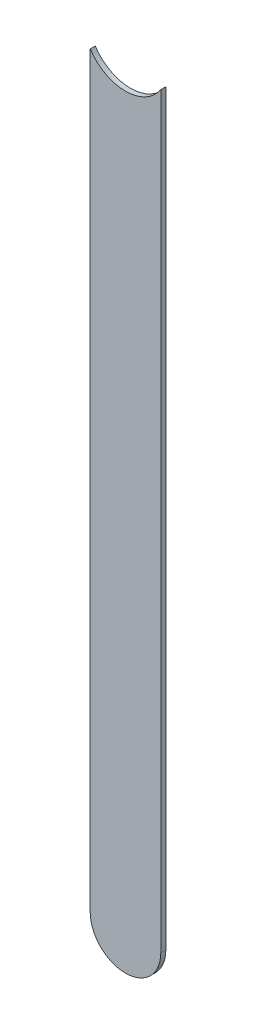
ISO-10303-21;
HEADER;
FILE_DESCRIPTION(('STEP AP214'),'2;1');
FILE_NAME('part.step','',(''),(''),'','','');
FILE_SCHEMA(('AUTOMOTIVE_DESIGN { 1 0 10303 214 1 1 1 1 }'));
ENDSEC;
DATA;
#1=APPLICATION_CONTEXT('core data for automotive mechanical design processes');
#2=APPLICATION_PROTOCOL_DEFINITION('international standard','automotive_design',2000,#1);
#3=PRODUCT_CONTEXT('',#1,'mechanical');
#4=PRODUCT('Part','Part','',(#3));
#5=PRODUCT_RELATED_PRODUCT_CATEGORY('part','',(#4));
#6=PRODUCT_DEFINITION_FORMATION('','',#4);
#7=PRODUCT_DEFINITION_CONTEXT('part definition',#1,'design');
#8=PRODUCT_DEFINITION('design','',#6,#7);
#9=PRODUCT_DEFINITION_SHAPE('','',#8);
#10=(LENGTH_UNIT() NAMED_UNIT(*) SI_UNIT(.MILLI.,.METRE.));
#11=(NAMED_UNIT(*) PLANE_ANGLE_UNIT() SI_UNIT($,.RADIAN.));
#12=(NAMED_UNIT(*) SI_UNIT($,.STERADIAN.) SOLID_ANGLE_UNIT());
#13=UNCERTAINTY_MEASURE_WITH_UNIT(LENGTH_MEASURE(1.E-05),#10,'distance_accuracy_value','');
#14=(GEOMETRIC_REPRESENTATION_CONTEXT(3) GLOBAL_UNCERTAINTY_ASSIGNED_CONTEXT((#13)) GLOBAL_UNIT_ASSIGNED_CONTEXT((#10,
#11,#12)) REPRESENTATION_CONTEXT('',''));
#15=CARTESIAN_POINT('',(0.,0.,0.));
#16=DIRECTION('',(0.,0.,1.));
#17=DIRECTION('',(1.,0.,0.));
#18=AXIS2_PLACEMENT_3D('',#15,#16,#17);
#19=CARTESIAN_POINT('',(119.4500151,98.840036,0.));
#20=DIRECTION('',(-1.,0.,0.));
#21=DIRECTION('',(0.,1.,0.));
#22=AXIS2_PLACEMENT_3D('',#19,#20,#21);
#23=PLANE('',#22);
#24=DIRECTION('',(0.,1.,0.));
#25=VECTOR('',#24,1.);
#26=CARTESIAN_POINT('',(119.4500151,98.840036,0.03556));
#27=LINE('',#26,#25);
#28=CARTESIAN_POINT('',(119.4500151,98.840036,0.03556));
#29=VERTEX_POINT('',#28);
#30=CARTESIAN_POINT('',(119.4500151,104.134189092145,0.03556));
#31=VERTEX_POINT('',#30);
#32=EDGE_CURVE('E11',#29,#31,#27,.T.);
#33=ORIENTED_EDGE('',*,*,#32,.F.);
#34=DIRECTION('',(0.,0.,1.));
#35=VECTOR('',#34,1.);
#36=CARTESIAN_POINT('',(119.4500151,98.840036,0.));
#37=LINE('',#36,#35);
#38=CARTESIAN_POINT('',(119.4500151,98.840036,0.));
#39=VERTEX_POINT('',#38);
#40=EDGE_CURVE('E24',#39,#29,#37,.T.);
#41=ORIENTED_EDGE('',*,*,#40,.F.);
#42=DIRECTION('',(0.,1.,0.));
#43=VECTOR('',#42,1.);
#44=CARTESIAN_POINT('',(119.4500151,98.840036,0.));
#45=LINE('',#44,#43);
#46=CARTESIAN_POINT('',(119.4500151,104.134189092145,0.));
#47=VERTEX_POINT('',#46);
#48=EDGE_CURVE('E75',#39,#47,#45,.T.);
#49=ORIENTED_EDGE('',*,*,#48,.T.);
#50=DIRECTION('',(0.,0.,1.));
#51=VECTOR('',#50,1.);
#52=CARTESIAN_POINT('',(119.4500151,104.134189092145,0.));
#53=LINE('',#52,#51);
#54=EDGE_CURVE('E37',#47,#31,#53,.T.);
#55=ORIENTED_EDGE('',*,*,#54,.T.);
#56=EDGE_LOOP('',(#33,#41,#49,#55));
#57=FACE_BOUND('',#56,.T.);
#58=ADVANCED_FACE('F17',(#57),#23,.F.);
#59=CARTESIAN_POINT('',(119.2000156,104.30002,0.));
#60=DIRECTION('',(0.,0.,-1.));
#61=DIRECTION('',(1.,0.,0.));
#62=AXIS2_PLACEMENT_3D('',#59,#60,#61);
#63=CYLINDRICAL_SURFACE('',#62,0.2999994);
#64=DIRECTION('',(0.,0.,1.));
#65=VECTOR('',#64,1.);
#66=CARTESIAN_POINT('',(118.9500161,104.134189092145,0.));
#67=LINE('',#66,#65);
#68=CARTESIAN_POINT('',(118.9500161,104.134189092145,0.));
#69=VERTEX_POINT('',#68);
#70=CARTESIAN_POINT('',(118.9500161,104.134189092145,0.03556));
#71=VERTEX_POINT('',#70);
#72=EDGE_CURVE('E67',#69,#71,#67,.T.);
#73=ORIENTED_EDGE('',*,*,#72,.T.);
#74=CARTESIAN_POINT('',(119.2000156,104.30002,0.03556));
#75=DIRECTION('',(0.,0.,1.));
#76=DIRECTION('',(1.,0.,0.));
#77=AXIS2_PLACEMENT_3D('',#74,#75,#76);
#78=CIRCLE('',#77,0.2999994);
#79=EDGE_CURVE('E82',#71,#31,#78,.T.);
#80=ORIENTED_EDGE('',*,*,#79,.T.);
#81=ORIENTED_EDGE('',*,*,#54,.F.);
#82=CARTESIAN_POINT('',(119.2000156,104.30002,0.));
#83=DIRECTION('',(0.,0.,1.));
#84=DIRECTION('',(1.,0.,0.));
#85=AXIS2_PLACEMENT_3D('',#82,#83,#84);
#86=CIRCLE('',#85,0.2999994);
#87=EDGE_CURVE('E80',#69,#47,#86,.T.);
#88=ORIENTED_EDGE('',*,*,#87,.F.);
#89=EDGE_LOOP('',(#73,#80,#81,#88));
#90=FACE_BOUND('',#89,.T.);
#91=ADVANCED_FACE('F88',(#90),#63,.F.);
#92=CARTESIAN_POINT('',(118.9500161,104.134189092145,0.));
#93=DIRECTION('',(1.,0.,0.));
#94=DIRECTION('',(0.,-1.,0.));
#95=AXIS2_PLACEMENT_3D('',#92,#93,#94);
#96=PLANE('',#95);
#97=DIRECTION('',(0.,-1.,0.));
#98=VECTOR('',#97,1.);
#99=CARTESIAN_POINT('',(118.9500161,104.30002,0.03556));
#100=LINE('',#99,#98);
#101=CARTESIAN_POINT('',(118.9500161,98.840036,0.03556));
#102=VERTEX_POINT('',#101);
#103=EDGE_CURVE('E71',#71,#102,#100,.T.);
#104=ORIENTED_EDGE('',*,*,#103,.F.);
#105=ORIENTED_EDGE('',*,*,#72,.F.);
#106=DIRECTION('',(0.,-1.,0.));
#107=VECTOR('',#106,1.);
#108=CARTESIAN_POINT('',(118.9500161,104.30002,0.));
#109=LINE('',#108,#107);
#110=CARTESIAN_POINT('',(118.9500161,98.840036,0.));
#111=VERTEX_POINT('',#110);
#112=EDGE_CURVE('E63',#69,#111,#109,.T.);
#113=ORIENTED_EDGE('',*,*,#112,.T.);
#114=DIRECTION('',(0.,0.,1.));
#115=VECTOR('',#114,1.);
#116=CARTESIAN_POINT('',(118.9500161,98.840036,0.));
#117=LINE('',#116,#115);
#118=EDGE_CURVE('E53',#111,#102,#117,.T.);
#119=ORIENTED_EDGE('',*,*,#118,.T.);
#120=EDGE_LOOP('',(#104,#105,#113,#119));
#121=FACE_BOUND('',#120,.T.);
#122=ADVANCED_FACE('F66',(#121),#96,.F.);
#123=CARTESIAN_POINT('',(119.2000156,98.840036,0.));
#124=DIRECTION('',(0.,0.,-1.));
#125=DIRECTION('',(-1.,0.,0.));
#126=AXIS2_PLACEMENT_3D('',#123,#124,#125);
#127=CYLINDRICAL_SURFACE('',#126,0.249999500000001);
#128=CARTESIAN_POINT('',(119.2000156,98.840036,0.03556));
#129=DIRECTION('',(0.,0.,1.));
#130=DIRECTION('',(-1.,0.,0.));
#131=AXIS2_PLACEMENT_3D('',#128,#129,#130);
#132=CIRCLE('',#131,0.249999500000001);
#133=EDGE_CURVE('E59',#102,#29,#132,.T.);
#134=ORIENTED_EDGE('',*,*,#133,.F.);
#135=ORIENTED_EDGE('',*,*,#118,.F.);
#136=CARTESIAN_POINT('',(119.2000156,98.840036,0.));
#137=DIRECTION('',(0.,0.,1.));
#138=DIRECTION('',(-1.,0.,0.));
#139=AXIS2_PLACEMENT_3D('',#136,#137,#138);
#140=CIRCLE('',#139,0.249999500000001);
#141=EDGE_CURVE('E57',#111,#39,#140,.T.);
#142=ORIENTED_EDGE('',*,*,#141,.T.);
#143=ORIENTED_EDGE('',*,*,#40,.T.);
#144=EDGE_LOOP('',(#134,#135,#142,#143));
#145=FACE_BOUND('',#144,.T.);
#146=ADVANCED_FACE('F55',(#145),#127,.T.);
#147=CARTESIAN_POINT('',(119.4500151,98.840036,0.));
#148=DIRECTION('',(0.,0.,-1.));
#149=DIRECTION('',(-1.,0.,0.));
#150=AXIS2_PLACEMENT_3D('',#147,#148,#149);
#151=PLANE('',#150);
#152=ORIENTED_EDGE('',*,*,#48,.F.);
#153=ORIENTED_EDGE('',*,*,#141,.F.);
#154=ORIENTED_EDGE('',*,*,#112,.F.);
#155=ORIENTED_EDGE('',*,*,#87,.T.);
#156=EDGE_LOOP('',(#152,#153,#154,#155));
#157=FACE_BOUND('',#156,.T.);
#158=ADVANCED_FACE('F74',(#157),#151,.T.);
#159=CARTESIAN_POINT('',(119.4500151,98.840036,0.03556));
#160=DIRECTION('',(0.,0.,-1.));
#161=DIRECTION('',(-1.,0.,0.));
#162=AXIS2_PLACEMENT_3D('',#159,#160,#161);
#163=PLANE('',#162);
#164=ORIENTED_EDGE('',*,*,#133,.T.);
#165=ORIENTED_EDGE('',*,*,#32,.T.);
#166=ORIENTED_EDGE('',*,*,#79,.F.);
#167=ORIENTED_EDGE('',*,*,#103,.T.);
#168=EDGE_LOOP('',(#164,#165,#166,#167));
#169=FACE_BOUND('',#168,.T.);
#170=ADVANCED_FACE('F91',(#169),#163,.F.);
#171=CLOSED_SHELL('',(#58,#91,#122,#146,#158,#170));
#172=MANIFOLD_SOLID_BREP('B1',#171);
#173=ADVANCED_BREP_SHAPE_REPRESENTATION('',(#18,#172),#14);
#174=SHAPE_DEFINITION_REPRESENTATION(#9,#173);
ENDSEC;
END-ISO-10303-21;
